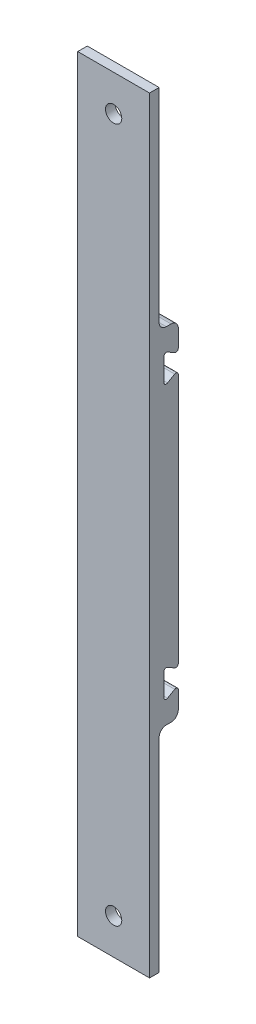
ISO-10303-21;
HEADER;
FILE_DESCRIPTION(('STEP AP214'),'2;1');
FILE_NAME('part.step','',(''),(''),'','','');
FILE_SCHEMA(('AUTOMOTIVE_DESIGN { 1 0 10303 214 1 1 1 1 }'));
ENDSEC;
DATA;
#1=APPLICATION_CONTEXT('core data for automotive mechanical design processes');
#2=APPLICATION_PROTOCOL_DEFINITION('international standard','automotive_design',2000,#1);
#3=PRODUCT_CONTEXT('',#1,'mechanical');
#4=PRODUCT('Part','Part','',(#3));
#5=PRODUCT_RELATED_PRODUCT_CATEGORY('part','',(#4));
#6=PRODUCT_DEFINITION_FORMATION('','',#4);
#7=PRODUCT_DEFINITION_CONTEXT('part definition',#1,'design');
#8=PRODUCT_DEFINITION('design','',#6,#7);
#9=PRODUCT_DEFINITION_SHAPE('','',#8);
#10=(LENGTH_UNIT() NAMED_UNIT(*) SI_UNIT(.MILLI.,.METRE.));
#11=(NAMED_UNIT(*) PLANE_ANGLE_UNIT() SI_UNIT($,.RADIAN.));
#12=(NAMED_UNIT(*) SI_UNIT($,.STERADIAN.) SOLID_ANGLE_UNIT());
#13=UNCERTAINTY_MEASURE_WITH_UNIT(LENGTH_MEASURE(1.E-05),#10,'distance_accuracy_value','');
#14=(GEOMETRIC_REPRESENTATION_CONTEXT(3) GLOBAL_UNCERTAINTY_ASSIGNED_CONTEXT((#13)) GLOBAL_UNIT_ASSIGNED_CONTEXT((#10,
#11,#12)) REPRESENTATION_CONTEXT('',''));
#15=CARTESIAN_POINT('',(0.,0.,0.));
#16=DIRECTION('',(0.,0.,1.));
#17=DIRECTION('',(1.,0.,0.));
#18=AXIS2_PLACEMENT_3D('',#15,#16,#17);
#19=CARTESIAN_POINT('',(0.,0.,-2.));
#20=DIRECTION('',(0.,0.,1.));
#21=DIRECTION('',(1.,0.,0.));
#22=AXIS2_PLACEMENT_3D('',#19,#20,#21);
#23=PLANE('',#22);
#24=CARTESIAN_POINT('',(7.49999999999998,7.5,-2.));
#25=DIRECTION('',(0.,0.,-1.));
#26=DIRECTION('',(-1.,0.,0.));
#27=AXIS2_PLACEMENT_3D('',#24,#25,#26);
#28=CIRCLE('',#27,1.69999999999999);
#29=CARTESIAN_POINT('',(5.79999999999999,7.5,-2.));
#30=VERTEX_POINT('',#29);
#31=EDGE_CURVE('E441',#30,#30,#28,.T.);
#32=ORIENTED_EDGE('',*,*,#31,.F.);
#33=EDGE_LOOP('',(#32));
#34=FACE_BOUND('',#33,.T.);
#35=DIRECTION('',(0.,-1.,0.));
#36=VECTOR('',#35,1.);
#37=CARTESIAN_POINT('',(0.,160.,-2.));
#38=LINE('',#37,#36);
#39=CARTESIAN_POINT('',(0.,42.5,-2.));
#40=VERTEX_POINT('',#39);
#41=CARTESIAN_POINT('',(0.,0.,-2.));
#42=VERTEX_POINT('',#41);
#43=EDGE_CURVE('E215',#40,#42,#38,.T.);
#44=ORIENTED_EDGE('',*,*,#43,.F.);
#45=DIRECTION('',(1.,0.,0.));
#46=VECTOR('',#45,1.);
#47=CARTESIAN_POINT('',(0.,42.5,-2.));
#48=LINE('',#47,#46);
#49=CARTESIAN_POINT('',(15.,42.5,-2.));
#50=VERTEX_POINT('',#49);
#51=EDGE_CURVE('E262',#40,#50,#48,.T.);
#52=ORIENTED_EDGE('',*,*,#51,.T.);
#53=DIRECTION('',(0.,1.,0.));
#54=VECTOR('',#53,1.);
#55=CARTESIAN_POINT('',(15.,160.,-2.));
#56=LINE('',#55,#54);
#57=CARTESIAN_POINT('',(15.,0.,-2.));
#58=VERTEX_POINT('',#57);
#59=EDGE_CURVE('E243',#58,#50,#56,.T.);
#60=ORIENTED_EDGE('',*,*,#59,.F.);
#61=DIRECTION('',(1.,0.,0.));
#62=VECTOR('',#61,1.);
#63=CARTESIAN_POINT('',(0.,0.,-2.));
#64=LINE('',#63,#62);
#65=EDGE_CURVE('E235',#42,#58,#64,.T.);
#66=ORIENTED_EDGE('',*,*,#65,.F.);
#67=EDGE_LOOP('',(#44,#52,#60,#66));
#68=FACE_BOUND('',#67,.T.);
#69=ADVANCED_FACE('F33',(#34,#68),#23,.F.);
#70=CARTESIAN_POINT('',(0.,160.,-2.));
#71=DIRECTION('',(-1.,0.,0.));
#72=DIRECTION('',(0.,-1.,0.));
#73=AXIS2_PLACEMENT_3D('',#70,#71,#72);
#74=PLANE('',#73);
#75=CARTESIAN_POINT('',(0.,114.5,-4.49999999999999));
#76=DIRECTION('',(-1.,0.,0.));
#77=DIRECTION('',(0.,-1.,0.));
#78=AXIS2_PLACEMENT_3D('',#75,#76,#77);
#79=CIRCLE('',#78,1.5);
#80=CARTESIAN_POINT('',(0.,116.,-4.49999999999999));
#81=VERTEX_POINT('',#80);
#82=CARTESIAN_POINT('',(0.,114.5,-5.99999999999999));
#83=VERTEX_POINT('',#82);
#84=EDGE_CURVE('E279',#81,#83,#79,.T.);
#85=ORIENTED_EDGE('',*,*,#84,.T.);
#86=DIRECTION('',(0.,1.,0.));
#87=VECTOR('',#86,1.);
#88=CARTESIAN_POINT('',(0.,59.,-6.));
#89=LINE('',#88,#87);
#90=CARTESIAN_POINT('',(0.,45.5,-6.));
#91=VERTEX_POINT('',#90);
#92=EDGE_CURVE('E393',#91,#83,#89,.T.);
#93=ORIENTED_EDGE('',*,*,#92,.F.);
#94=CARTESIAN_POINT('',(0.,45.5,-4.5));
#95=DIRECTION('',(-1.,0.,0.));
#96=DIRECTION('',(0.,-1.,0.));
#97=AXIS2_PLACEMENT_3D('',#94,#95,#96);
#98=CIRCLE('',#97,1.5);
#99=CARTESIAN_POINT('',(0.,44.,-4.5));
#100=VERTEX_POINT('',#99);
#101=EDGE_CURVE('E281',#91,#100,#98,.T.);
#102=ORIENTED_EDGE('',*,*,#101,.T.);
#103=DIRECTION('',(0.,0.,-1.));
#104=VECTOR('',#103,1.);
#105=CARTESIAN_POINT('',(0.,44.,0.));
#106=LINE('',#105,#104);
#107=CARTESIAN_POINT('',(0.,44.,-3.5));
#108=VERTEX_POINT('',#107);
#109=EDGE_CURVE('E389',#108,#100,#106,.T.);
#110=ORIENTED_EDGE('',*,*,#109,.F.);
#111=CARTESIAN_POINT('',(0.,42.5,-3.5));
#112=DIRECTION('',(-1.,0.,0.));
#113=DIRECTION('',(0.,-1.,0.));
#114=AXIS2_PLACEMENT_3D('',#111,#112,#113);
#115=CIRCLE('',#114,1.5);
#116=EDGE_CURVE('E224',#108,#40,#115,.F.);
#117=ORIENTED_EDGE('',*,*,#116,.T.);
#118=ORIENTED_EDGE('',*,*,#43,.T.);
#119=DIRECTION('',(0.,0.,1.));
#120=VECTOR('',#119,1.);
#121=CARTESIAN_POINT('',(0.,0.,-2.));
#122=LINE('',#121,#120);
#123=CARTESIAN_POINT('',(0.,0.,0.));
#124=VERTEX_POINT('',#123);
#125=EDGE_CURVE('E220',#42,#124,#122,.T.);
#126=ORIENTED_EDGE('',*,*,#125,.T.);
#127=DIRECTION('',(0.,-1.,0.));
#128=VECTOR('',#127,1.);
#129=CARTESIAN_POINT('',(0.,160.,0.));
#130=LINE('',#129,#128);
#131=CARTESIAN_POINT('',(0.,160.,0.));
#132=VERTEX_POINT('',#131);
#133=EDGE_CURVE('E252',#132,#124,#130,.T.);
#134=ORIENTED_EDGE('',*,*,#133,.F.);
#135=DIRECTION('',(0.,0.,1.));
#136=VECTOR('',#135,1.);
#137=CARTESIAN_POINT('',(0.,160.,-2.));
#138=LINE('',#137,#136);
#139=CARTESIAN_POINT('',(0.,160.,-2.));
#140=VERTEX_POINT('',#139);
#141=EDGE_CURVE('E260',#140,#132,#138,.T.);
#142=ORIENTED_EDGE('',*,*,#141,.F.);
#143=CARTESIAN_POINT('',(0.,117.5,-2.));
#144=VERTEX_POINT('',#143);
#145=EDGE_CURVE('E229',#140,#144,#38,.T.);
#146=ORIENTED_EDGE('',*,*,#145,.T.);
#147=CARTESIAN_POINT('',(0.,117.5,-3.5));
#148=DIRECTION('',(-1.,0.,0.));
#149=DIRECTION('',(0.,-1.,0.));
#150=AXIS2_PLACEMENT_3D('',#147,#148,#149);
#151=CIRCLE('',#150,1.5);
#152=CARTESIAN_POINT('',(0.,116.,-3.5));
#153=VERTEX_POINT('',#152);
#154=EDGE_CURVE('E296',#144,#153,#151,.F.);
#155=ORIENTED_EDGE('',*,*,#154,.T.);
#156=DIRECTION('',(0.,0.,1.));
#157=VECTOR('',#156,1.);
#158=CARTESIAN_POINT('',(0.,116.,0.));
#159=LINE('',#158,#157);
#160=EDGE_CURVE('E254',#81,#153,#159,.T.);
#161=ORIENTED_EDGE('',*,*,#160,.F.);
#162=EDGE_LOOP('',(#85,#93,#102,#110,#117,#118,#126,#134,#142,#146,#155,#161));
#163=FACE_BOUND('',#162,.T.);
#164=ADVANCED_FACE('F218',(#163),#74,.T.);
#165=CARTESIAN_POINT('',(0.,160.,-2.));
#166=DIRECTION('',(0.,1.,0.));
#167=DIRECTION('',(0.,0.,1.));
#168=AXIS2_PLACEMENT_3D('',#165,#166,#167);
#169=PLANE('',#168);
#170=DIRECTION('',(-1.,0.,0.));
#171=VECTOR('',#170,1.);
#172=CARTESIAN_POINT('',(0.,160.,0.));
#173=LINE('',#172,#171);
#174=CARTESIAN_POINT('',(15.,160.,0.));
#175=VERTEX_POINT('',#174);
#176=EDGE_CURVE('E230',#175,#132,#173,.T.);
#177=ORIENTED_EDGE('',*,*,#176,.F.);
#178=DIRECTION('',(0.,0.,1.));
#179=VECTOR('',#178,1.);
#180=CARTESIAN_POINT('',(15.,160.,-2.));
#181=LINE('',#180,#179);
#182=CARTESIAN_POINT('',(15.,160.,-2.));
#183=VERTEX_POINT('',#182);
#184=EDGE_CURVE('E263',#183,#175,#181,.T.);
#185=ORIENTED_EDGE('',*,*,#184,.F.);
#186=DIRECTION('',(-1.,0.,0.));
#187=VECTOR('',#186,1.);
#188=CARTESIAN_POINT('',(0.,160.,-2.));
#189=LINE('',#188,#187);
#190=EDGE_CURVE('E239',#183,#140,#189,.T.);
#191=ORIENTED_EDGE('',*,*,#190,.T.);
#192=ORIENTED_EDGE('',*,*,#141,.T.);
#193=EDGE_LOOP('',(#177,#185,#191,#192));
#194=FACE_BOUND('',#193,.T.);
#195=ADVANCED_FACE('F427',(#194),#169,.T.);
#196=CARTESIAN_POINT('',(15.,160.,-2.));
#197=DIRECTION('',(1.,0.,0.));
#198=DIRECTION('',(0.,1.,0.));
#199=AXIS2_PLACEMENT_3D('',#196,#197,#198);
#200=PLANE('',#199);
#201=ORIENTED_EDGE('',*,*,#184,.T.);
#202=DIRECTION('',(0.,1.,0.));
#203=VECTOR('',#202,1.);
#204=CARTESIAN_POINT('',(15.,160.,0.));
#205=LINE('',#204,#203);
#206=CARTESIAN_POINT('',(15.,0.,0.));
#207=VERTEX_POINT('',#206);
#208=EDGE_CURVE('E256',#207,#175,#205,.T.);
#209=ORIENTED_EDGE('',*,*,#208,.F.);
#210=DIRECTION('',(0.,0.,1.));
#211=VECTOR('',#210,1.);
#212=CARTESIAN_POINT('',(15.,0.,-2.));
#213=LINE('',#212,#211);
#214=EDGE_CURVE('E238',#58,#207,#213,.T.);
#215=ORIENTED_EDGE('',*,*,#214,.F.);
#216=ORIENTED_EDGE('',*,*,#59,.T.);
#217=CARTESIAN_POINT('',(15.,42.5,-3.5));
#218=DIRECTION('',(1.,0.,0.));
#219=DIRECTION('',(0.,1.,0.));
#220=AXIS2_PLACEMENT_3D('',#217,#218,#219);
#221=CIRCLE('',#220,1.5);
#222=CARTESIAN_POINT('',(15.,44.,-3.5));
#223=VERTEX_POINT('',#222);
#224=EDGE_CURVE('E293',#50,#223,#221,.F.);
#225=ORIENTED_EDGE('',*,*,#224,.T.);
#226=DIRECTION('',(0.,0.,-1.));
#227=VECTOR('',#226,1.);
#228=CARTESIAN_POINT('',(15.,44.,0.));
#229=LINE('',#228,#227);
#230=CARTESIAN_POINT('',(15.,44.,-4.5));
#231=VERTEX_POINT('',#230);
#232=EDGE_CURVE('E390',#223,#231,#229,.T.);
#233=ORIENTED_EDGE('',*,*,#232,.T.);
#234=CARTESIAN_POINT('',(15.,45.5,-4.5));
#235=DIRECTION('',(1.,0.,0.));
#236=DIRECTION('',(0.,1.,0.));
#237=AXIS2_PLACEMENT_3D('',#234,#235,#236);
#238=CIRCLE('',#237,1.5);
#239=CARTESIAN_POINT('',(15.,45.5,-6.));
#240=VERTEX_POINT('',#239);
#241=EDGE_CURVE('E275',#231,#240,#238,.T.);
#242=ORIENTED_EDGE('',*,*,#241,.T.);
#243=DIRECTION('',(0.,1.,0.));
#244=VECTOR('',#243,1.);
#245=CARTESIAN_POINT('',(15.,59.,-6.));
#246=LINE('',#245,#244);
#247=CARTESIAN_POINT('',(15.,49.1339745962156,-6.));
#248=VERTEX_POINT('',#247);
#249=EDGE_CURVE('E382',#240,#248,#246,.T.);
#250=ORIENTED_EDGE('',*,*,#249,.T.);
#251=CARTESIAN_POINT('',(15.,49.1339745962156,-5.5));
#252=DIRECTION('',(1.,0.,0.));
#253=DIRECTION('',(0.,1.,0.));
#254=AXIS2_PLACEMENT_3D('',#251,#252,#253);
#255=CIRCLE('',#254,0.5);
#256=CARTESIAN_POINT('',(15.,49.5669872981078,-5.25));
#257=VERTEX_POINT('',#256);
#258=EDGE_CURVE('E309',#248,#257,#255,.T.);
#259=ORIENTED_EDGE('',*,*,#258,.T.);
#260=DIRECTION('',(0.,0.499999999999997,-0.86602540378444));
#261=VECTOR('',#260,1.);
#262=CARTESIAN_POINT('',(15.,48.2679491924311,-3.));
#263=LINE('',#262,#261);
#264=CARTESIAN_POINT('',(15.,48.7009618943233,-3.75));
#265=VERTEX_POINT('',#264);
#266=EDGE_CURVE('E451',#265,#257,#263,.T.);
#267=ORIENTED_EDGE('',*,*,#266,.F.);
#268=CARTESIAN_POINT('',(15.,49.1339745962156,-3.5));
#269=DIRECTION('',(1.,0.,0.));
#270=DIRECTION('',(0.,1.,0.));
#271=AXIS2_PLACEMENT_3D('',#268,#269,#270);
#272=CIRCLE('',#271,0.5);
#273=CARTESIAN_POINT('',(15.,49.1339745962156,-3.));
#274=VERTEX_POINT('',#273);
#275=EDGE_CURVE('E366',#265,#274,#272,.F.);
#276=ORIENTED_EDGE('',*,*,#275,.T.);
#277=DIRECTION('',(0.,-1.,0.));
#278=VECTOR('',#277,1.);
#279=CARTESIAN_POINT('',(15.,54.7320508075689,-3.));
#280=LINE('',#279,#278);
#281=CARTESIAN_POINT('',(15.,53.8660254037844,-3.));
#282=VERTEX_POINT('',#281);
#283=EDGE_CURVE('E453',#282,#274,#280,.T.);
#284=ORIENTED_EDGE('',*,*,#283,.F.);
#285=CARTESIAN_POINT('',(15.,53.8660254037844,-3.5));
#286=DIRECTION('',(1.,0.,0.));
#287=DIRECTION('',(0.,1.,0.));
#288=AXIS2_PLACEMENT_3D('',#285,#286,#287);
#289=CIRCLE('',#288,0.5);
#290=CARTESIAN_POINT('',(15.,54.2990381056766,-3.75));
#291=VERTEX_POINT('',#290);
#292=EDGE_CURVE('E368',#282,#291,#289,.F.);
#293=ORIENTED_EDGE('',*,*,#292,.T.);
#294=DIRECTION('',(0.,0.499999999999996,0.866025403784441));
#295=VECTOR('',#294,1.);
#296=CARTESIAN_POINT('',(15.,53.,-6.));
#297=LINE('',#296,#295);
#298=CARTESIAN_POINT('',(15.,53.4330127018922,-5.25));
#299=VERTEX_POINT('',#298);
#300=EDGE_CURVE('E456',#299,#291,#297,.T.);
#301=ORIENTED_EDGE('',*,*,#300,.F.);
#302=CARTESIAN_POINT('',(15.,53.8660254037844,-5.5));
#303=DIRECTION('',(1.,0.,0.));
#304=DIRECTION('',(0.,1.,0.));
#305=AXIS2_PLACEMENT_3D('',#302,#303,#304);
#306=CIRCLE('',#305,0.5);
#307=CARTESIAN_POINT('',(15.,53.8660254037844,-6.));
#308=VERTEX_POINT('',#307);
#309=EDGE_CURVE('E306',#299,#308,#306,.T.);
#310=ORIENTED_EDGE('',*,*,#309,.T.);
#311=DIRECTION('',(0.,1.,0.));
#312=VECTOR('',#311,1.);
#313=CARTESIAN_POINT('',(15.,116.,-5.99999999999999));
#314=LINE('',#313,#312);
#315=CARTESIAN_POINT('',(15.,106.133974596216,-5.99999999999999));
#316=VERTEX_POINT('',#315);
#317=EDGE_CURVE('E405',#308,#316,#314,.T.);
#318=ORIENTED_EDGE('',*,*,#317,.T.);
#319=CARTESIAN_POINT('',(15.,106.133974596216,-5.49999999999999));
#320=DIRECTION('',(1.,0.,0.));
#321=DIRECTION('',(0.,1.,0.));
#322=AXIS2_PLACEMENT_3D('',#319,#320,#321);
#323=CIRCLE('',#322,0.5);
#324=CARTESIAN_POINT('',(15.,106.566987298108,-5.24999999999999));
#325=VERTEX_POINT('',#324);
#326=EDGE_CURVE('E313',#316,#325,#323,.T.);
#327=ORIENTED_EDGE('',*,*,#326,.T.);
#328=DIRECTION('',(0.,0.499999999999996,-0.866025403784441));
#329=VECTOR('',#328,1.);
#330=CARTESIAN_POINT('',(15.,105.267949192431,-3.));
#331=LINE('',#330,#329);
#332=CARTESIAN_POINT('',(15.,105.700961894323,-3.74999999999999));
#333=VERTEX_POINT('',#332);
#334=EDGE_CURVE('E467',#333,#325,#331,.T.);
#335=ORIENTED_EDGE('',*,*,#334,.F.);
#336=CARTESIAN_POINT('',(15.,106.133974596216,-3.5));
#337=DIRECTION('',(1.,0.,0.));
#338=DIRECTION('',(0.,1.,0.));
#339=AXIS2_PLACEMENT_3D('',#336,#337,#338);
#340=CIRCLE('',#339,0.5);
#341=CARTESIAN_POINT('',(15.,106.133974596216,-3.));
#342=VERTEX_POINT('',#341);
#343=EDGE_CURVE('E360',#333,#342,#340,.F.);
#344=ORIENTED_EDGE('',*,*,#343,.T.);
#345=DIRECTION('',(0.,-1.,0.));
#346=VECTOR('',#345,1.);
#347=CARTESIAN_POINT('',(15.,111.732050807569,-2.99999999999999));
#348=LINE('',#347,#346);
#349=CARTESIAN_POINT('',(15.,110.866025403784,-2.99999999999999));
#350=VERTEX_POINT('',#349);
#351=EDGE_CURVE('E471',#350,#342,#348,.T.);
#352=ORIENTED_EDGE('',*,*,#351,.F.);
#353=CARTESIAN_POINT('',(15.,110.866025403784,-3.49999999999999));
#354=DIRECTION('',(1.,0.,0.));
#355=DIRECTION('',(0.,1.,0.));
#356=AXIS2_PLACEMENT_3D('',#353,#354,#355);
#357=CIRCLE('',#356,0.5);
#358=CARTESIAN_POINT('',(15.,111.299038105677,-3.74999999999999));
#359=VERTEX_POINT('',#358);
#360=EDGE_CURVE('E362',#350,#359,#357,.F.);
#361=ORIENTED_EDGE('',*,*,#360,.T.);
#362=DIRECTION('',(0.,0.499999999999996,0.866025403784441));
#363=VECTOR('',#362,1.);
#364=CARTESIAN_POINT('',(15.,110.,-5.99999999999999));
#365=LINE('',#364,#363);
#366=CARTESIAN_POINT('',(15.,110.433012701892,-5.25));
#367=VERTEX_POINT('',#366);
#368=EDGE_CURVE('E460',#367,#359,#365,.T.);
#369=ORIENTED_EDGE('',*,*,#368,.F.);
#370=CARTESIAN_POINT('',(15.,110.866025403784,-5.49999999999999));
#371=DIRECTION('',(1.,0.,0.));
#372=DIRECTION('',(0.,1.,0.));
#373=AXIS2_PLACEMENT_3D('',#370,#371,#372);
#374=CIRCLE('',#373,0.5);
#375=CARTESIAN_POINT('',(15.,110.866025403784,-5.99999999999999));
#376=VERTEX_POINT('',#375);
#377=EDGE_CURVE('E311',#367,#376,#374,.T.);
#378=ORIENTED_EDGE('',*,*,#377,.T.);
#379=CARTESIAN_POINT('',(15.,114.5,-5.99999999999999));
#380=VERTEX_POINT('',#379);
#381=EDGE_CURVE('E401',#376,#380,#314,.T.);
#382=ORIENTED_EDGE('',*,*,#381,.T.);
#383=CARTESIAN_POINT('',(15.,114.5,-4.49999999999999));
#384=DIRECTION('',(1.,0.,0.));
#385=DIRECTION('',(0.,1.,0.));
#386=AXIS2_PLACEMENT_3D('',#383,#384,#385);
#387=CIRCLE('',#386,1.5);
#388=CARTESIAN_POINT('',(15.,116.,-4.49999999999999));
#389=VERTEX_POINT('',#388);
#390=EDGE_CURVE('E273',#380,#389,#387,.T.);
#391=ORIENTED_EDGE('',*,*,#390,.T.);
#392=DIRECTION('',(0.,0.,1.));
#393=VECTOR('',#392,1.);
#394=CARTESIAN_POINT('',(15.,116.,0.));
#395=LINE('',#394,#393);
#396=CARTESIAN_POINT('',(15.,116.,-3.5));
#397=VERTEX_POINT('',#396);
#398=EDGE_CURVE('E402',#389,#397,#395,.T.);
#399=ORIENTED_EDGE('',*,*,#398,.T.);
#400=CARTESIAN_POINT('',(15.,117.5,-3.5));
#401=DIRECTION('',(1.,0.,0.));
#402=DIRECTION('',(0.,1.,0.));
#403=AXIS2_PLACEMENT_3D('',#400,#401,#402);
#404=CIRCLE('',#403,1.5);
#405=CARTESIAN_POINT('',(15.,117.5,-2.));
#406=VERTEX_POINT('',#405);
#407=EDGE_CURVE('E298',#397,#406,#404,.F.);
#408=ORIENTED_EDGE('',*,*,#407,.T.);
#409=EDGE_CURVE('E244',#406,#183,#56,.T.);
#410=ORIENTED_EDGE('',*,*,#409,.T.);
#411=EDGE_LOOP('',(#201,#209,#215,#216,#225,#233,#242,#250,#259,#267,#276,#284,#293,#301,#310,
#318,#327,#335,#344,#352,#361,#369,#378,#382,#391,#399,#408,#410));
#412=FACE_BOUND('',#411,.T.);
#413=ADVANCED_FACE('F385',(#412),#200,.T.);
#414=CARTESIAN_POINT('',(0.,0.,-2.));
#415=DIRECTION('',(0.,-1.,0.));
#416=DIRECTION('',(0.,0.,-1.));
#417=AXIS2_PLACEMENT_3D('',#414,#415,#416);
#418=PLANE('',#417);
#419=DIRECTION('',(1.,0.,0.));
#420=VECTOR('',#419,1.);
#421=CARTESIAN_POINT('',(0.,0.,0.));
#422=LINE('',#421,#420);
#423=EDGE_CURVE('E237',#124,#207,#422,.T.);
#424=ORIENTED_EDGE('',*,*,#423,.F.);
#425=ORIENTED_EDGE('',*,*,#125,.F.);
#426=ORIENTED_EDGE('',*,*,#65,.T.);
#427=ORIENTED_EDGE('',*,*,#214,.T.);
#428=EDGE_LOOP('',(#424,#425,#426,#427));
#429=FACE_BOUND('',#428,.T.);
#430=ADVANCED_FACE('F234',(#429),#418,.T.);
#431=CARTESIAN_POINT('',(7.5,152.5,-2.));
#432=DIRECTION('',(0.,0.,-1.));
#433=DIRECTION('',(-1.,0.,0.));
#434=AXIS2_PLACEMENT_3D('',#431,#432,#433);
#435=CIRCLE('',#434,1.69999999999999);
#436=CARTESIAN_POINT('',(5.80000000000001,152.5,-2.));
#437=VERTEX_POINT('',#436);
#438=EDGE_CURVE('E445',#437,#437,#435,.T.);
#439=ORIENTED_EDGE('',*,*,#438,.F.);
#440=EDGE_LOOP('',(#439));
#441=FACE_BOUND('',#440,.T.);
#442=ORIENTED_EDGE('',*,*,#409,.F.);
#443=DIRECTION('',(-1.,0.,0.));
#444=VECTOR('',#443,1.);
#445=CARTESIAN_POINT('',(0.,117.5,-2.));
#446=LINE('',#445,#444);
#447=EDGE_CURVE('E290',#406,#144,#446,.T.);
#448=ORIENTED_EDGE('',*,*,#447,.T.);
#449=ORIENTED_EDGE('',*,*,#145,.F.);
#450=ORIENTED_EDGE('',*,*,#190,.F.);
#451=EDGE_LOOP('',(#442,#448,#449,#450));
#452=FACE_BOUND('',#451,.T.);
#453=ADVANCED_FACE('F423',(#441,#452),#23,.F.);
#454=CARTESIAN_POINT('',(0.,0.,0.));
#455=DIRECTION('',(0.,0.,1.));
#456=DIRECTION('',(1.,0.,0.));
#457=AXIS2_PLACEMENT_3D('',#454,#455,#456);
#458=PLANE('',#457);
#459=ORIENTED_EDGE('',*,*,#133,.T.);
#460=ORIENTED_EDGE('',*,*,#423,.T.);
#461=ORIENTED_EDGE('',*,*,#208,.T.);
#462=ORIENTED_EDGE('',*,*,#176,.T.);
#463=EDGE_LOOP('',(#459,#460,#461,#462));
#464=FACE_BOUND('',#463,.T.);
#465=CARTESIAN_POINT('',(7.5,152.5,0.));
#466=DIRECTION('',(0.,0.,-1.));
#467=DIRECTION('',(-1.,0.,0.));
#468=AXIS2_PLACEMENT_3D('',#465,#466,#467);
#469=CIRCLE('',#468,1.7);
#470=CARTESIAN_POINT('',(5.8,152.5,0.));
#471=VERTEX_POINT('',#470);
#472=EDGE_CURVE('E437',#471,#471,#469,.T.);
#473=ORIENTED_EDGE('',*,*,#472,.T.);
#474=EDGE_LOOP('',(#473));
#475=FACE_BOUND('',#474,.T.);
#476=CARTESIAN_POINT('',(7.49999999999998,7.5,0.));
#477=DIRECTION('',(0.,0.,-1.));
#478=DIRECTION('',(-1.,0.,0.));
#479=AXIS2_PLACEMENT_3D('',#476,#477,#478);
#480=CIRCLE('',#479,1.7);
#481=CARTESIAN_POINT('',(5.79999999999998,7.5,0.));
#482=VERTEX_POINT('',#481);
#483=EDGE_CURVE('E395',#482,#482,#480,.T.);
#484=ORIENTED_EDGE('',*,*,#483,.T.);
#485=EDGE_LOOP('',(#484));
#486=FACE_BOUND('',#485,.T.);
#487=ADVANCED_FACE('F430',(#464,#475,#486),#458,.T.);
#488=CARTESIAN_POINT('',(-16.1554944214035,116.,0.));
#489=DIRECTION('',(0.,1.,0.));
#490=DIRECTION('',(-1.,0.,0.));
#491=AXIS2_PLACEMENT_3D('',#488,#489,#490);
#492=PLANE('',#491);
#493=ORIENTED_EDGE('',*,*,#398,.F.);
#494=DIRECTION('',(1.,0.,0.));
#495=VECTOR('',#494,1.);
#496=CARTESIAN_POINT('',(-16.1554944214035,116.,-4.49999999999999));
#497=LINE('',#496,#495);
#498=EDGE_CURVE('E288',#389,#81,#497,.F.);
#499=ORIENTED_EDGE('',*,*,#498,.T.);
#500=ORIENTED_EDGE('',*,*,#160,.T.);
#501=DIRECTION('',(-1.,0.,0.));
#502=VECTOR('',#501,1.);
#503=CARTESIAN_POINT('',(-16.1554944214035,116.,-3.5));
#504=LINE('',#503,#502);
#505=EDGE_CURVE('E286',#153,#397,#504,.F.);
#506=ORIENTED_EDGE('',*,*,#505,.T.);
#507=EDGE_LOOP('',(#493,#499,#500,#506));
#508=FACE_BOUND('',#507,.T.);
#509=ADVANCED_FACE('F412',(#508),#492,.T.);
#510=CARTESIAN_POINT('',(-16.1554944214035,116.,-5.99999999999999));
#511=DIRECTION('',(0.,0.,-1.));
#512=DIRECTION('',(0.,1.,0.));
#513=AXIS2_PLACEMENT_3D('',#510,#511,#512);
#514=PLANE('',#513);
#515=DIRECTION('',(0.,1.,0.));
#516=VECTOR('',#515,1.);
#517=CARTESIAN_POINT('',(1.49999999999999,107.,-5.99999999999999));
#518=LINE('',#517,#516);
#519=CARTESIAN_POINT('',(1.49999999999999,106.133974596216,-5.99999999999999));
#520=VERTEX_POINT('',#519);
#521=CARTESIAN_POINT('',(1.49999999999999,110.866025403784,-5.99999999999999));
#522=VERTEX_POINT('',#521);
#523=EDGE_CURVE('E470',#520,#522,#518,.T.);
#524=ORIENTED_EDGE('',*,*,#523,.F.);
#525=DIRECTION('',(1.,0.,0.));
#526=VECTOR('',#525,1.);
#527=CARTESIAN_POINT('',(15.,106.133974596216,-5.99999999999999));
#528=LINE('',#527,#526);
#529=EDGE_CURVE('E303',#520,#316,#528,.T.);
#530=ORIENTED_EDGE('',*,*,#529,.T.);
#531=ORIENTED_EDGE('',*,*,#317,.F.);
#532=DIRECTION('',(1.,0.,0.));
#533=VECTOR('',#532,1.);
#534=CARTESIAN_POINT('',(1.49999999999999,53.8660254037844,-6.));
#535=LINE('',#534,#533);
#536=CARTESIAN_POINT('',(1.49999999999999,53.8660254037844,-6.));
#537=VERTEX_POINT('',#536);
#538=EDGE_CURVE('E353',#308,#537,#535,.F.);
#539=ORIENTED_EDGE('',*,*,#538,.T.);
#540=DIRECTION('',(0.,1.,0.));
#541=VECTOR('',#540,1.);
#542=CARTESIAN_POINT('',(1.49999999999999,50.,-6.));
#543=LINE('',#542,#541);
#544=CARTESIAN_POINT('',(1.49999999999999,49.1339745962156,-6.));
#545=VERTEX_POINT('',#544);
#546=EDGE_CURVE('E48',#545,#537,#543,.T.);
#547=ORIENTED_EDGE('',*,*,#546,.F.);
#548=DIRECTION('',(1.,0.,0.));
#549=VECTOR('',#548,1.);
#550=CARTESIAN_POINT('',(15.,49.1339745962156,-6.));
#551=LINE('',#550,#549);
#552=EDGE_CURVE('E355',#545,#248,#551,.T.);
#553=ORIENTED_EDGE('',*,*,#552,.T.);
#554=ORIENTED_EDGE('',*,*,#249,.F.);
#555=DIRECTION('',(1.,0.,0.));
#556=VECTOR('',#555,1.);
#557=CARTESIAN_POINT('',(-16.1554944214035,45.5,-6.));
#558=LINE('',#557,#556);
#559=EDGE_CURVE('E277',#240,#91,#558,.F.);
#560=ORIENTED_EDGE('',*,*,#559,.T.);
#561=ORIENTED_EDGE('',*,*,#92,.T.);
#562=DIRECTION('',(1.,0.,0.));
#563=VECTOR('',#562,1.);
#564=CARTESIAN_POINT('',(-16.1554944214035,114.5,-5.99999999999999));
#565=LINE('',#564,#563);
#566=EDGE_CURVE('E283',#83,#380,#565,.T.);
#567=ORIENTED_EDGE('',*,*,#566,.T.);
#568=ORIENTED_EDGE('',*,*,#381,.F.);
#569=DIRECTION('',(1.,0.,0.));
#570=VECTOR('',#569,1.);
#571=CARTESIAN_POINT('',(1.49999999999999,110.866025403784,-5.99999999999999));
#572=LINE('',#571,#570);
#573=EDGE_CURVE('E300',#376,#522,#572,.F.);
#574=ORIENTED_EDGE('',*,*,#573,.T.);
#575=EDGE_LOOP('',(#524,#530,#531,#539,#547,#553,#554,#560,#561,#567,#568,#574));
#576=FACE_BOUND('',#575,.T.);
#577=ADVANCED_FACE('F381',(#576),#514,.T.);
#578=CARTESIAN_POINT('',(-16.1554944214035,44.,0.));
#579=DIRECTION('',(0.,-1.,0.));
#580=DIRECTION('',(1.,0.,0.));
#581=AXIS2_PLACEMENT_3D('',#578,#579,#580);
#582=PLANE('',#581);
#583=ORIENTED_EDGE('',*,*,#232,.F.);
#584=DIRECTION('',(1.,0.,0.));
#585=VECTOR('',#584,1.);
#586=CARTESIAN_POINT('',(-16.1554944214035,44.,-3.5));
#587=LINE('',#586,#585);
#588=EDGE_CURVE('E271',#223,#108,#587,.F.);
#589=ORIENTED_EDGE('',*,*,#588,.T.);
#590=ORIENTED_EDGE('',*,*,#109,.T.);
#591=DIRECTION('',(1.,0.,0.));
#592=VECTOR('',#591,1.);
#593=CARTESIAN_POINT('',(-16.1554944214035,44.,-4.5));
#594=LINE('',#593,#592);
#595=EDGE_CURVE('E268',#100,#231,#594,.T.);
#596=ORIENTED_EDGE('',*,*,#595,.T.);
#597=EDGE_LOOP('',(#583,#589,#590,#596));
#598=FACE_BOUND('',#597,.T.);
#599=ADVANCED_FACE('F583',(#598),#582,.T.);
#600=CARTESIAN_POINT('',(0.,42.5,-3.5));
#601=DIRECTION('',(1.,0.,0.));
#602=DIRECTION('',(0.,1.,0.));
#603=AXIS2_PLACEMENT_3D('',#600,#601,#602);
#604=CYLINDRICAL_SURFACE('',#603,1.5);
#605=ORIENTED_EDGE('',*,*,#116,.F.);
#606=ORIENTED_EDGE('',*,*,#588,.F.);
#607=ORIENTED_EDGE('',*,*,#224,.F.);
#608=ORIENTED_EDGE('',*,*,#51,.F.);
#609=EDGE_LOOP('',(#605,#606,#607,#608));
#610=FACE_BOUND('',#609,.T.);
#611=ADVANCED_FACE('F579',(#610),#604,.F.);
#612=CARTESIAN_POINT('',(-16.1554944214035,45.5,-4.5));
#613=DIRECTION('',(1.,0.,0.));
#614=DIRECTION('',(0.,1.,0.));
#615=AXIS2_PLACEMENT_3D('',#612,#613,#614);
#616=CYLINDRICAL_SURFACE('',#615,1.5);
#617=ORIENTED_EDGE('',*,*,#101,.F.);
#618=ORIENTED_EDGE('',*,*,#559,.F.);
#619=ORIENTED_EDGE('',*,*,#241,.F.);
#620=ORIENTED_EDGE('',*,*,#595,.F.);
#621=EDGE_LOOP('',(#617,#618,#619,#620));
#622=FACE_BOUND('',#621,.T.);
#623=ADVANCED_FACE('F582',(#622),#616,.T.);
#624=CARTESIAN_POINT('',(-16.1554944214035,114.5,-4.49999999999999));
#625=DIRECTION('',(1.,0.,0.));
#626=DIRECTION('',(0.,1.,0.));
#627=AXIS2_PLACEMENT_3D('',#624,#625,#626);
#628=CYLINDRICAL_SURFACE('',#627,1.5);
#629=ORIENTED_EDGE('',*,*,#84,.F.);
#630=ORIENTED_EDGE('',*,*,#498,.F.);
#631=ORIENTED_EDGE('',*,*,#390,.F.);
#632=ORIENTED_EDGE('',*,*,#566,.F.);
#633=EDGE_LOOP('',(#629,#630,#631,#632));
#634=FACE_BOUND('',#633,.T.);
#635=ADVANCED_FACE('F587',(#634),#628,.T.);
#636=CARTESIAN_POINT('',(0.,117.5,-3.5));
#637=DIRECTION('',(-1.,0.,0.));
#638=DIRECTION('',(0.,-1.,0.));
#639=AXIS2_PLACEMENT_3D('',#636,#637,#638);
#640=CYLINDRICAL_SURFACE('',#639,1.5);
#641=ORIENTED_EDGE('',*,*,#407,.F.);
#642=ORIENTED_EDGE('',*,*,#505,.F.);
#643=ORIENTED_EDGE('',*,*,#154,.F.);
#644=ORIENTED_EDGE('',*,*,#447,.F.);
#645=EDGE_LOOP('',(#641,#642,#643,#644));
#646=FACE_BOUND('',#645,.T.);
#647=ADVANCED_FACE('F417',(#646),#640,.F.);
#648=CARTESIAN_POINT('',(7.49999999999998,7.5,-2.));
#649=DIRECTION('',(0.,0.,-1.));
#650=DIRECTION('',(-1.,0.,0.));
#651=AXIS2_PLACEMENT_3D('',#648,#649,#650);
#652=CYLINDRICAL_SURFACE('',#651,1.69999999999999);
#653=ORIENTED_EDGE('',*,*,#483,.F.);
#654=EDGE_LOOP('',(#653));
#655=FACE_BOUND('',#654,.T.);
#656=ORIENTED_EDGE('',*,*,#31,.T.);
#657=EDGE_LOOP('',(#656));
#658=FACE_BOUND('',#657,.T.);
#659=ADVANCED_FACE('F551',(#655,#658),#652,.F.);
#660=CARTESIAN_POINT('',(7.5,152.5,-2.));
#661=DIRECTION('',(0.,0.,-1.));
#662=DIRECTION('',(-1.,0.,0.));
#663=AXIS2_PLACEMENT_3D('',#660,#661,#662);
#664=CYLINDRICAL_SURFACE('',#663,1.69999999999999);
#665=ORIENTED_EDGE('',*,*,#472,.F.);
#666=EDGE_LOOP('',(#665));
#667=FACE_BOUND('',#666,.T.);
#668=ORIENTED_EDGE('',*,*,#438,.T.);
#669=EDGE_LOOP('',(#668));
#670=FACE_BOUND('',#669,.T.);
#671=ADVANCED_FACE('F544',(#667,#670),#664,.F.);
#672=CARTESIAN_POINT('',(1.49999999999999,48.2679491924311,-3.));
#673=DIRECTION('',(0.,-0.86602540378444,-0.499999999999997));
#674=DIRECTION('',(0.,0.499999999999997,-0.86602540378444));
#675=AXIS2_PLACEMENT_3D('',#672,#673,#674);
#676=PLANE('',#675);
#677=DIRECTION('',(0.,0.499999999999997,-0.86602540378444));
#678=VECTOR('',#677,1.);
#679=CARTESIAN_POINT('',(1.49999999999999,48.2679491924311,-3.));
#680=LINE('',#679,#678);
#681=CARTESIAN_POINT('',(1.49999999999999,48.7009618943233,-3.75));
#682=VERTEX_POINT('',#681);
#683=CARTESIAN_POINT('',(1.49999999999999,49.5669872981078,-5.25));
#684=VERTEX_POINT('',#683);
#685=EDGE_CURVE('E375',#682,#684,#680,.T.);
#686=ORIENTED_EDGE('',*,*,#685,.F.);
#687=DIRECTION('',(1.,0.,0.));
#688=VECTOR('',#687,1.);
#689=CARTESIAN_POINT('',(15.,48.7009618943233,-3.75));
#690=LINE('',#689,#688);
#691=EDGE_CURVE('E336',#682,#265,#690,.T.);
#692=ORIENTED_EDGE('',*,*,#691,.T.);
#693=ORIENTED_EDGE('',*,*,#266,.T.);
#694=DIRECTION('',(1.,0.,0.));
#695=VECTOR('',#694,1.);
#696=CARTESIAN_POINT('',(1.49999999999999,49.5669872981078,-5.25));
#697=LINE('',#696,#695);
#698=EDGE_CURVE('E334',#257,#684,#697,.F.);
#699=ORIENTED_EDGE('',*,*,#698,.T.);
#700=EDGE_LOOP('',(#686,#692,#693,#699));
#701=FACE_BOUND('',#700,.T.);
#702=ADVANCED_FACE('F542',(#701),#676,.F.);
#703=CARTESIAN_POINT('',(1.49999999999999,54.7320508075689,-3.));
#704=DIRECTION('',(0.,0.,1.));
#705=DIRECTION('',(0.,-1.,0.));
#706=AXIS2_PLACEMENT_3D('',#703,#704,#705);
#707=PLANE('',#706);
#708=ORIENTED_EDGE('',*,*,#283,.T.);
#709=DIRECTION('',(1.,0.,0.));
#710=VECTOR('',#709,1.);
#711=CARTESIAN_POINT('',(1.49999999999999,49.1339745962156,-3.));
#712=LINE('',#711,#710);
#713=CARTESIAN_POINT('',(1.49999999999999,49.1339745962156,-3.));
#714=VERTEX_POINT('',#713);
#715=EDGE_CURVE('E342',#274,#714,#712,.F.);
#716=ORIENTED_EDGE('',*,*,#715,.T.);
#717=DIRECTION('',(0.,-1.,0.));
#718=VECTOR('',#717,1.);
#719=CARTESIAN_POINT('',(1.49999999999999,54.7320508075689,-3.));
#720=LINE('',#719,#718);
#721=CARTESIAN_POINT('',(1.49999999999999,53.8660254037844,-3.));
#722=VERTEX_POINT('',#721);
#723=EDGE_CURVE('E461',#722,#714,#720,.T.);
#724=ORIENTED_EDGE('',*,*,#723,.F.);
#725=DIRECTION('',(1.,0.,0.));
#726=VECTOR('',#725,1.);
#727=CARTESIAN_POINT('',(15.,53.8660254037844,-3.));
#728=LINE('',#727,#726);
#729=EDGE_CURVE('E339',#722,#282,#728,.T.);
#730=ORIENTED_EDGE('',*,*,#729,.T.);
#731=EDGE_LOOP('',(#708,#716,#724,#730));
#732=FACE_BOUND('',#731,.T.);
#733=ADVANCED_FACE('F535',(#732),#707,.F.);
#734=CARTESIAN_POINT('',(1.49999999999999,53.,-6.));
#735=DIRECTION('',(0.,0.866025403784441,-0.499999999999996));
#736=DIRECTION('',(0.,0.499999999999996,0.866025403784441));
#737=AXIS2_PLACEMENT_3D('',#734,#735,#736);
#738=PLANE('',#737);
#739=ORIENTED_EDGE('',*,*,#300,.T.);
#740=DIRECTION('',(1.,0.,0.));
#741=VECTOR('',#740,1.);
#742=CARTESIAN_POINT('',(1.49999999999999,54.2990381056766,-3.75));
#743=LINE('',#742,#741);
#744=CARTESIAN_POINT('',(1.49999999999999,54.2990381056766,-3.75));
#745=VERTEX_POINT('',#744);
#746=EDGE_CURVE('E351',#291,#745,#743,.F.);
#747=ORIENTED_EDGE('',*,*,#746,.T.);
#748=DIRECTION('',(0.,0.499999999999996,0.866025403784441));
#749=VECTOR('',#748,1.);
#750=CARTESIAN_POINT('',(1.49999999999999,53.,-6.));
#751=LINE('',#750,#749);
#752=CARTESIAN_POINT('',(1.49999999999999,53.4330127018922,-5.25));
#753=VERTEX_POINT('',#752);
#754=EDGE_CURVE('E463',#753,#745,#751,.T.);
#755=ORIENTED_EDGE('',*,*,#754,.F.);
#756=DIRECTION('',(1.,0.,0.));
#757=VECTOR('',#756,1.);
#758=CARTESIAN_POINT('',(15.,53.4330127018922,-5.25));
#759=LINE('',#758,#757);
#760=EDGE_CURVE('E348',#753,#299,#759,.T.);
#761=ORIENTED_EDGE('',*,*,#760,.T.);
#762=EDGE_LOOP('',(#739,#747,#755,#761));
#763=FACE_BOUND('',#762,.T.);
#764=ADVANCED_FACE('F527',(#763),#738,.F.);
#765=CARTESIAN_POINT('',(1.50000000000003,0.,0.));
#766=DIRECTION('',(1.,0.,0.));
#767=DIRECTION('',(0.,1.,0.));
#768=AXIS2_PLACEMENT_3D('',#765,#766,#767);
#769=PLANE('',#768);
#770=ORIENTED_EDGE('',*,*,#723,.T.);
#771=CARTESIAN_POINT('',(1.5,49.1339745962156,-3.5));
#772=DIRECTION('',(1.,0.,0.));
#773=DIRECTION('',(0.,1.,0.));
#774=AXIS2_PLACEMENT_3D('',#771,#772,#773);
#775=CIRCLE('',#774,0.5);
#776=EDGE_CURVE('E346',#714,#682,#775,.T.);
#777=ORIENTED_EDGE('',*,*,#776,.T.);
#778=ORIENTED_EDGE('',*,*,#685,.T.);
#779=CARTESIAN_POINT('',(1.49999999999999,49.1339745962156,-5.5));
#780=DIRECTION('',(1.,0.,0.));
#781=DIRECTION('',(0.,1.,0.));
#782=AXIS2_PLACEMENT_3D('',#779,#780,#781);
#783=CIRCLE('',#782,0.5);
#784=EDGE_CURVE('E41',#684,#545,#783,.F.);
#785=ORIENTED_EDGE('',*,*,#784,.T.);
#786=ORIENTED_EDGE('',*,*,#546,.T.);
#787=CARTESIAN_POINT('',(1.49999999999999,53.8660254037844,-5.5));
#788=DIRECTION('',(1.,0.,0.));
#789=DIRECTION('',(0.,1.,0.));
#790=AXIS2_PLACEMENT_3D('',#787,#788,#789);
#791=CIRCLE('',#790,0.5);
#792=EDGE_CURVE('E11',#537,#753,#791,.F.);
#793=ORIENTED_EDGE('',*,*,#792,.T.);
#794=ORIENTED_EDGE('',*,*,#754,.T.);
#795=CARTESIAN_POINT('',(1.49999999999999,53.8660254037844,-3.5));
#796=DIRECTION('',(1.,0.,0.));
#797=DIRECTION('',(0.,1.,0.));
#798=AXIS2_PLACEMENT_3D('',#795,#796,#797);
#799=CIRCLE('',#798,0.5);
#800=EDGE_CURVE('E344',#745,#722,#799,.T.);
#801=ORIENTED_EDGE('',*,*,#800,.T.);
#802=EDGE_LOOP('',(#770,#777,#778,#785,#786,#793,#794,#801));
#803=FACE_BOUND('',#802,.T.);
#804=ADVANCED_FACE('F373',(#803),#769,.T.);
#805=CARTESIAN_POINT('',(1.49999999999999,105.267949192431,-3.));
#806=DIRECTION('',(0.,-0.866025403784441,-0.499999999999996));
#807=DIRECTION('',(0.,0.499999999999996,-0.866025403784441));
#808=AXIS2_PLACEMENT_3D('',#805,#806,#807);
#809=PLANE('',#808);
#810=ORIENTED_EDGE('',*,*,#334,.T.);
#811=DIRECTION('',(1.,0.,0.));
#812=VECTOR('',#811,1.);
#813=CARTESIAN_POINT('',(1.49999999999999,106.566987298108,-5.24999999999999));
#814=LINE('',#813,#812);
#815=CARTESIAN_POINT('',(1.49999999999999,106.566987298108,-5.24999999999999));
#816=VERTEX_POINT('',#815);
#817=EDGE_CURVE('E318',#325,#816,#814,.F.);
#818=ORIENTED_EDGE('',*,*,#817,.T.);
#819=DIRECTION('',(0.,0.499999999999996,-0.866025403784441));
#820=VECTOR('',#819,1.);
#821=CARTESIAN_POINT('',(1.49999999999999,105.267949192431,-3.));
#822=LINE('',#821,#820);
#823=CARTESIAN_POINT('',(1.49999999999999,105.700961894323,-3.74999999999999));
#824=VERTEX_POINT('',#823);
#825=EDGE_CURVE('E450',#824,#816,#822,.T.);
#826=ORIENTED_EDGE('',*,*,#825,.F.);
#827=DIRECTION('',(1.,0.,0.));
#828=VECTOR('',#827,1.);
#829=CARTESIAN_POINT('',(15.,105.700961894323,-3.74999999999999));
#830=LINE('',#829,#828);
#831=EDGE_CURVE('E315',#824,#333,#830,.T.);
#832=ORIENTED_EDGE('',*,*,#831,.T.);
#833=EDGE_LOOP('',(#810,#818,#826,#832));
#834=FACE_BOUND('',#833,.T.);
#835=ADVANCED_FACE('F515',(#834),#809,.F.);
#836=CARTESIAN_POINT('',(1.49999999999999,111.732050807569,-2.99999999999999));
#837=DIRECTION('',(0.,0.,1.));
#838=DIRECTION('',(0.,-1.,0.));
#839=AXIS2_PLACEMENT_3D('',#836,#837,#838);
#840=PLANE('',#839);
#841=ORIENTED_EDGE('',*,*,#351,.T.);
#842=DIRECTION('',(1.,0.,0.));
#843=VECTOR('',#842,1.);
#844=CARTESIAN_POINT('',(1.49999999999999,106.133974596216,-3.));
#845=LINE('',#844,#843);
#846=CARTESIAN_POINT('',(1.49999999999999,106.133974596216,-3.));
#847=VERTEX_POINT('',#846);
#848=EDGE_CURVE('E323',#342,#847,#845,.F.);
#849=ORIENTED_EDGE('',*,*,#848,.T.);
#850=DIRECTION('',(0.,-1.,0.));
#851=VECTOR('',#850,1.);
#852=CARTESIAN_POINT('',(1.49999999999999,111.732050807569,-2.99999999999999));
#853=LINE('',#852,#851);
#854=CARTESIAN_POINT('',(1.49999999999999,110.866025403784,-2.99999999999999));
#855=VERTEX_POINT('',#854);
#856=EDGE_CURVE('E478',#855,#847,#853,.T.);
#857=ORIENTED_EDGE('',*,*,#856,.F.);
#858=DIRECTION('',(1.,0.,0.));
#859=VECTOR('',#858,1.);
#860=CARTESIAN_POINT('',(15.,110.866025403784,-2.99999999999999));
#861=LINE('',#860,#859);
#862=EDGE_CURVE('E320',#855,#350,#861,.T.);
#863=ORIENTED_EDGE('',*,*,#862,.T.);
#864=EDGE_LOOP('',(#841,#849,#857,#863));
#865=FACE_BOUND('',#864,.T.);
#866=ADVANCED_FACE('F506',(#865),#840,.F.);
#867=CARTESIAN_POINT('',(1.49999999999999,110.,-5.99999999999999));
#868=DIRECTION('',(0.,0.866025403784441,-0.499999999999996));
#869=DIRECTION('',(0.,0.499999999999996,0.866025403784441));
#870=AXIS2_PLACEMENT_3D('',#867,#868,#869);
#871=PLANE('',#870);
#872=ORIENTED_EDGE('',*,*,#368,.T.);
#873=DIRECTION('',(1.,0.,0.));
#874=VECTOR('',#873,1.);
#875=CARTESIAN_POINT('',(1.49999999999999,111.299038105677,-3.74999999999999));
#876=LINE('',#875,#874);
#877=CARTESIAN_POINT('',(1.49999999999999,111.299038105677,-3.74999999999999));
#878=VERTEX_POINT('',#877);
#879=EDGE_CURVE('E332',#359,#878,#876,.F.);
#880=ORIENTED_EDGE('',*,*,#879,.T.);
#881=DIRECTION('',(0.,0.499999999999996,0.866025403784441));
#882=VECTOR('',#881,1.);
#883=CARTESIAN_POINT('',(1.49999999999999,110.,-5.99999999999999));
#884=LINE('',#883,#882);
#885=CARTESIAN_POINT('',(1.49999999999999,110.433012701892,-5.25));
#886=VERTEX_POINT('',#885);
#887=EDGE_CURVE('E481',#886,#878,#884,.T.);
#888=ORIENTED_EDGE('',*,*,#887,.F.);
#889=DIRECTION('',(1.,0.,0.));
#890=VECTOR('',#889,1.);
#891=CARTESIAN_POINT('',(15.,110.433012701892,-5.25));
#892=LINE('',#891,#890);
#893=EDGE_CURVE('E329',#886,#367,#892,.T.);
#894=ORIENTED_EDGE('',*,*,#893,.T.);
#895=EDGE_LOOP('',(#872,#880,#888,#894));
#896=FACE_BOUND('',#895,.T.);
#897=ADVANCED_FACE('F497',(#896),#871,.F.);
#898=CARTESIAN_POINT('',(1.49999999999999,0.,0.));
#899=DIRECTION('',(1.,0.,0.));
#900=DIRECTION('',(0.,0.,-1.));
#901=AXIS2_PLACEMENT_3D('',#898,#899,#900);
#902=PLANE('',#901);
#903=ORIENTED_EDGE('',*,*,#856,.T.);
#904=CARTESIAN_POINT('',(1.49999999999999,106.133974596216,-3.5));
#905=DIRECTION('',(1.,0.,0.));
#906=DIRECTION('',(0.,0.,-1.));
#907=AXIS2_PLACEMENT_3D('',#904,#905,#906);
#908=CIRCLE('',#907,0.5);
#909=EDGE_CURVE('E327',#847,#824,#908,.T.);
#910=ORIENTED_EDGE('',*,*,#909,.T.);
#911=ORIENTED_EDGE('',*,*,#825,.T.);
#912=CARTESIAN_POINT('',(1.49999999999999,106.133974596216,-5.49999999999999));
#913=DIRECTION('',(1.,0.,0.));
#914=DIRECTION('',(0.,0.,-1.));
#915=AXIS2_PLACEMENT_3D('',#912,#913,#914);
#916=CIRCLE('',#915,0.5);
#917=EDGE_CURVE('E357',#816,#520,#916,.F.);
#918=ORIENTED_EDGE('',*,*,#917,.T.);
#919=ORIENTED_EDGE('',*,*,#523,.T.);
#920=CARTESIAN_POINT('',(1.49999999999999,110.866025403784,-5.49999999999999));
#921=DIRECTION('',(1.,0.,0.));
#922=DIRECTION('',(0.,0.,-1.));
#923=AXIS2_PLACEMENT_3D('',#920,#921,#922);
#924=CIRCLE('',#923,0.5);
#925=EDGE_CURVE('E364',#522,#886,#924,.F.);
#926=ORIENTED_EDGE('',*,*,#925,.T.);
#927=ORIENTED_EDGE('',*,*,#887,.T.);
#928=CARTESIAN_POINT('',(1.49999999999999,110.866025403784,-3.49999999999999));
#929=DIRECTION('',(1.,0.,0.));
#930=DIRECTION('',(0.,0.,-1.));
#931=AXIS2_PLACEMENT_3D('',#928,#929,#930);
#932=CIRCLE('',#931,0.5);
#933=EDGE_CURVE('E325',#878,#855,#932,.T.);
#934=ORIENTED_EDGE('',*,*,#933,.T.);
#935=EDGE_LOOP('',(#903,#910,#911,#918,#919,#926,#927,#934));
#936=FACE_BOUND('',#935,.T.);
#937=ADVANCED_FACE('F485',(#936),#902,.T.);
#938=CARTESIAN_POINT('',(-16.1554944214035,106.133974596216,-5.49999999999999));
#939=DIRECTION('',(-1.,0.,0.));
#940=DIRECTION('',(0.,-1.,0.));
#941=AXIS2_PLACEMENT_3D('',#938,#939,#940);
#942=CYLINDRICAL_SURFACE('',#941,0.5);
#943=ORIENTED_EDGE('',*,*,#917,.F.);
#944=ORIENTED_EDGE('',*,*,#817,.F.);
#945=ORIENTED_EDGE('',*,*,#326,.F.);
#946=ORIENTED_EDGE('',*,*,#529,.F.);
#947=EDGE_LOOP('',(#943,#944,#945,#946));
#948=FACE_BOUND('',#947,.T.);
#949=ADVANCED_FACE('F518',(#948),#942,.T.);
#950=CARTESIAN_POINT('',(1.49999999999999,106.133974596216,-3.5));
#951=DIRECTION('',(-1.,0.,0.));
#952=DIRECTION('',(0.,-1.,0.));
#953=AXIS2_PLACEMENT_3D('',#950,#951,#952);
#954=CYLINDRICAL_SURFACE('',#953,0.5);
#955=ORIENTED_EDGE('',*,*,#909,.F.);
#956=ORIENTED_EDGE('',*,*,#848,.F.);
#957=ORIENTED_EDGE('',*,*,#343,.F.);
#958=ORIENTED_EDGE('',*,*,#831,.F.);
#959=EDGE_LOOP('',(#955,#956,#957,#958));
#960=FACE_BOUND('',#959,.T.);
#961=ADVANCED_FACE('F512',(#960),#954,.F.);
#962=CARTESIAN_POINT('',(1.49999999999999,110.866025403784,-3.49999999999999));
#963=DIRECTION('',(-1.,0.,0.));
#964=DIRECTION('',(0.,-1.,0.));
#965=AXIS2_PLACEMENT_3D('',#962,#963,#964);
#966=CYLINDRICAL_SURFACE('',#965,0.5);
#967=ORIENTED_EDGE('',*,*,#933,.F.);
#968=ORIENTED_EDGE('',*,*,#879,.F.);
#969=ORIENTED_EDGE('',*,*,#360,.F.);
#970=ORIENTED_EDGE('',*,*,#862,.F.);
#971=EDGE_LOOP('',(#967,#968,#969,#970));
#972=FACE_BOUND('',#971,.T.);
#973=ADVANCED_FACE('F503',(#972),#966,.F.);
#974=CARTESIAN_POINT('',(1.49999999999999,110.866025403784,-5.49999999999999));
#975=DIRECTION('',(-1.,0.,0.));
#976=DIRECTION('',(0.,-1.,0.));
#977=AXIS2_PLACEMENT_3D('',#974,#975,#976);
#978=CYLINDRICAL_SURFACE('',#977,0.5);
#979=ORIENTED_EDGE('',*,*,#925,.F.);
#980=ORIENTED_EDGE('',*,*,#573,.F.);
#981=ORIENTED_EDGE('',*,*,#377,.F.);
#982=ORIENTED_EDGE('',*,*,#893,.F.);
#983=EDGE_LOOP('',(#979,#980,#981,#982));
#984=FACE_BOUND('',#983,.T.);
#985=ADVANCED_FACE('F494',(#984),#978,.T.);
#986=CARTESIAN_POINT('',(1.49999999999999,49.1339745962156,-3.5));
#987=DIRECTION('',(-1.,0.,0.));
#988=DIRECTION('',(0.,-1.,0.));
#989=AXIS2_PLACEMENT_3D('',#986,#987,#988);
#990=CYLINDRICAL_SURFACE('',#989,0.5);
#991=ORIENTED_EDGE('',*,*,#776,.F.);
#992=ORIENTED_EDGE('',*,*,#715,.F.);
#993=ORIENTED_EDGE('',*,*,#275,.F.);
#994=ORIENTED_EDGE('',*,*,#691,.F.);
#995=EDGE_LOOP('',(#991,#992,#993,#994));
#996=FACE_BOUND('',#995,.T.);
#997=ADVANCED_FACE('F539',(#996),#990,.F.);
#998=CARTESIAN_POINT('',(1.49999999999999,53.8660254037844,-3.5));
#999=DIRECTION('',(-1.,0.,0.));
#1000=DIRECTION('',(0.,-1.,0.));
#1001=AXIS2_PLACEMENT_3D('',#998,#999,#1000);
#1002=CYLINDRICAL_SURFACE('',#1001,0.5);
#1003=ORIENTED_EDGE('',*,*,#800,.F.);
#1004=ORIENTED_EDGE('',*,*,#746,.F.);
#1005=ORIENTED_EDGE('',*,*,#292,.F.);
#1006=ORIENTED_EDGE('',*,*,#729,.F.);
#1007=EDGE_LOOP('',(#1003,#1004,#1005,#1006));
#1008=FACE_BOUND('',#1007,.T.);
#1009=ADVANCED_FACE('F530',(#1008),#1002,.F.);
#1010=CARTESIAN_POINT('',(-16.1554944214035,49.1339745962156,-5.5));
#1011=DIRECTION('',(-1.,0.,0.));
#1012=DIRECTION('',(0.,-1.,0.));
#1013=AXIS2_PLACEMENT_3D('',#1010,#1011,#1012);
#1014=CYLINDRICAL_SURFACE('',#1013,0.5);
#1015=ORIENTED_EDGE('',*,*,#784,.F.);
#1016=ORIENTED_EDGE('',*,*,#698,.F.);
#1017=ORIENTED_EDGE('',*,*,#258,.F.);
#1018=ORIENTED_EDGE('',*,*,#552,.F.);
#1019=EDGE_LOOP('',(#1015,#1016,#1017,#1018));
#1020=FACE_BOUND('',#1019,.T.);
#1021=ADVANCED_FACE('F378',(#1020),#1014,.T.);
#1022=CARTESIAN_POINT('',(1.49999999999999,53.8660254037844,-5.5));
#1023=DIRECTION('',(-1.,0.,0.));
#1024=DIRECTION('',(0.,-1.,0.));
#1025=AXIS2_PLACEMENT_3D('',#1022,#1023,#1024);
#1026=CYLINDRICAL_SURFACE('',#1025,0.5);
#1027=ORIENTED_EDGE('',*,*,#792,.F.);
#1028=ORIENTED_EDGE('',*,*,#538,.F.);
#1029=ORIENTED_EDGE('',*,*,#309,.F.);
#1030=ORIENTED_EDGE('',*,*,#760,.F.);
#1031=EDGE_LOOP('',(#1027,#1028,#1029,#1030));
#1032=FACE_BOUND('',#1031,.T.);
#1033=ADVANCED_FACE('F35',(#1032),#1026,.T.);
#1034=CLOSED_SHELL('',(#69,#164,#195,#413,#430,#453,#487,#509,#577,#599,#611,#623,#635,#647,
#659,#671,#702,#733,#764,#804,#835,#866,#897,#937,#949,#961,#973,#985,#997,#1009,#1021,#1033));
#1035=MANIFOLD_SOLID_BREP('B2',#1034);
#1036=ADVANCED_BREP_SHAPE_REPRESENTATION('',(#18,#1035),#14);
#1037=SHAPE_DEFINITION_REPRESENTATION(#9,#1036);
ENDSEC;
END-ISO-10303-21;
